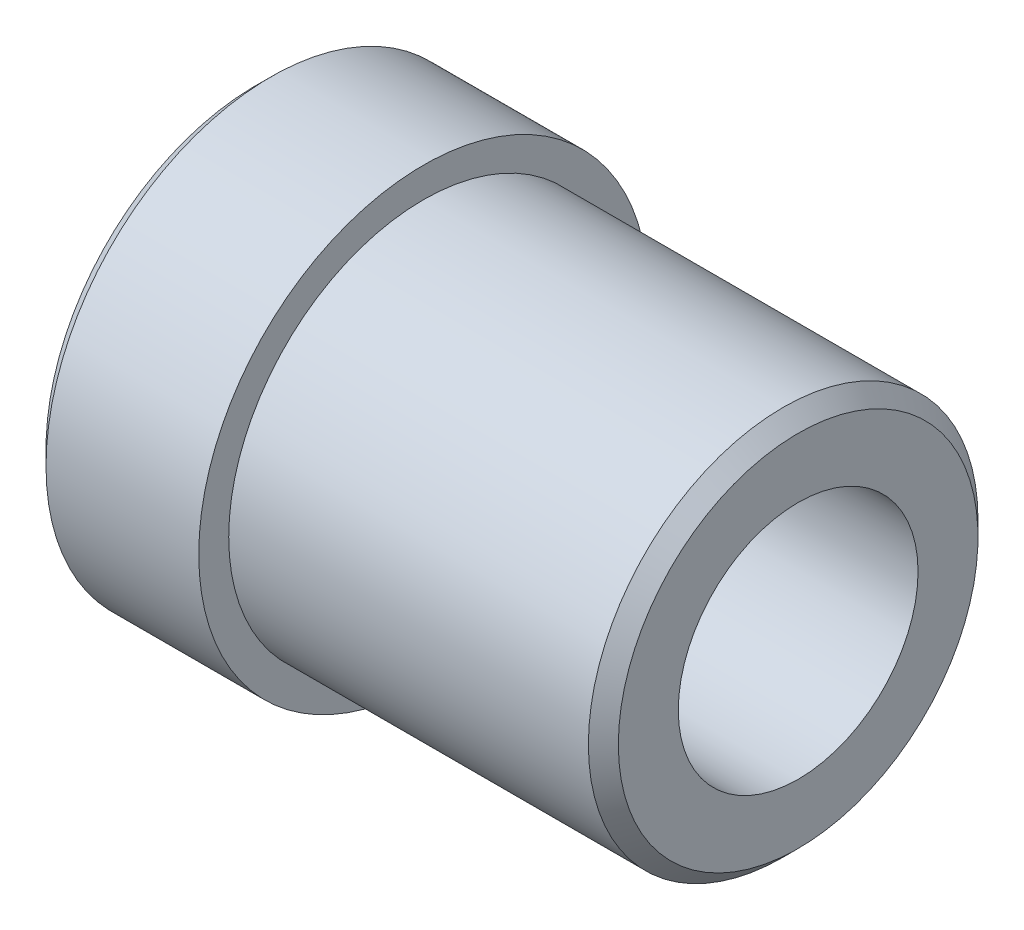
ISO-10303-21;
HEADER;
FILE_DESCRIPTION(('STEP AP214'),'2;1');
FILE_NAME('part.step','',(''),(''),'','','');
FILE_SCHEMA(('AUTOMOTIVE_DESIGN { 1 0 10303 214 1 1 1 1 }'));
ENDSEC;
DATA;
#1=APPLICATION_CONTEXT('core data for automotive mechanical design processes');
#2=APPLICATION_PROTOCOL_DEFINITION('international standard','automotive_design',2000,#1);
#3=PRODUCT_CONTEXT('',#1,'mechanical');
#4=PRODUCT('Part','Part','',(#3));
#5=PRODUCT_RELATED_PRODUCT_CATEGORY('part','',(#4));
#6=PRODUCT_DEFINITION_FORMATION('','',#4);
#7=PRODUCT_DEFINITION_CONTEXT('part definition',#1,'design');
#8=PRODUCT_DEFINITION('design','',#6,#7);
#9=PRODUCT_DEFINITION_SHAPE('','',#8);
#10=(LENGTH_UNIT() NAMED_UNIT(*) SI_UNIT(.MILLI.,.METRE.));
#11=(NAMED_UNIT(*) PLANE_ANGLE_UNIT() SI_UNIT($,.RADIAN.));
#12=(NAMED_UNIT(*) SI_UNIT($,.STERADIAN.) SOLID_ANGLE_UNIT());
#13=UNCERTAINTY_MEASURE_WITH_UNIT(LENGTH_MEASURE(1.E-05),#10,'distance_accuracy_value','');
#14=(GEOMETRIC_REPRESENTATION_CONTEXT(3) GLOBAL_UNCERTAINTY_ASSIGNED_CONTEXT((#13)) GLOBAL_UNIT_ASSIGNED_CONTEXT((#10,
#11,#12)) REPRESENTATION_CONTEXT('',''));
#15=CARTESIAN_POINT('',(0.,0.,0.));
#16=DIRECTION('',(0.,0.,1.));
#17=DIRECTION('',(1.,0.,0.));
#18=AXIS2_PLACEMENT_3D('',#15,#16,#17);
#19=CARTESIAN_POINT('',(0.,15.,0.));
#20=DIRECTION('',(1.,0.,0.));
#21=DIRECTION('',(0.,0.,-1.));
#22=AXIS2_PLACEMENT_3D('',#19,#20,#21);
#23=PLANE('',#22);
#24=CARTESIAN_POINT('',(0.,0.,0.));
#25=DIRECTION('',(1.,0.,0.));
#26=DIRECTION('',(0.,0.,-1.));
#27=AXIS2_PLACEMENT_3D('',#24,#25,#26);
#28=CIRCLE('',#27,14.);
#29=CARTESIAN_POINT('',(0.,0.,-14.));
#30=VERTEX_POINT('',#29);
#31=EDGE_CURVE('E48',#30,#30,#28,.F.);
#32=ORIENTED_EDGE('',*,*,#31,.T.);
#33=EDGE_LOOP('',(#32));
#34=FACE_BOUND('',#33,.T.);
#35=CARTESIAN_POINT('',(0.,0.,0.));
#36=DIRECTION('',(-1.,0.,0.));
#37=DIRECTION('',(0.,0.,1.));
#38=AXIS2_PLACEMENT_3D('',#35,#36,#37);
#39=CIRCLE('',#38,8.);
#40=CARTESIAN_POINT('',(0.,0.,8.));
#41=VERTEX_POINT('',#40);
#42=EDGE_CURVE('E63',#41,#41,#39,.T.);
#43=ORIENTED_EDGE('',*,*,#42,.F.);
#44=EDGE_LOOP('',(#43));
#45=FACE_BOUND('',#44,.T.);
#46=ADVANCED_FACE('F33',(#34,#45),#23,.F.);
#47=CARTESIAN_POINT('',(0.,0.,0.));
#48=DIRECTION('',(-1.,0.,0.));
#49=DIRECTION('',(0.,0.,1.));
#50=AXIS2_PLACEMENT_3D('',#47,#48,#49);
#51=CYLINDRICAL_SURFACE('',#50,15.);
#52=CARTESIAN_POINT('',(1.00000000000001,0.,0.));
#53=DIRECTION('',(1.,0.,0.));
#54=DIRECTION('',(0.,0.,-1.));
#55=AXIS2_PLACEMENT_3D('',#52,#53,#54);
#56=CIRCLE('',#55,15.);
#57=CARTESIAN_POINT('',(1.00000000000001,0.,-15.));
#58=VERTEX_POINT('',#57);
#59=EDGE_CURVE('E43',#58,#58,#56,.T.);
#60=ORIENTED_EDGE('',*,*,#59,.T.);
#61=EDGE_LOOP('',(#60));
#62=FACE_BOUND('',#61,.T.);
#63=CARTESIAN_POINT('',(11.1929723502304,0.,0.));
#64=DIRECTION('',(-1.,0.,0.));
#65=DIRECTION('',(0.,0.,1.));
#66=AXIS2_PLACEMENT_3D('',#63,#64,#65);
#67=CIRCLE('',#66,15.);
#68=CARTESIAN_POINT('',(11.1929723502304,0.,15.));
#69=VERTEX_POINT('',#68);
#70=EDGE_CURVE('E54',#69,#69,#67,.T.);
#71=ORIENTED_EDGE('',*,*,#70,.T.);
#72=EDGE_LOOP('',(#71));
#73=FACE_BOUND('',#72,.T.);
#74=ADVANCED_FACE('F70',(#62,#73),#51,.T.);
#75=CARTESIAN_POINT('',(11.1929723502304,13.,0.));
#76=DIRECTION('',(-1.,0.,0.));
#77=DIRECTION('',(0.,0.,1.));
#78=AXIS2_PLACEMENT_3D('',#75,#76,#77);
#79=PLANE('',#78);
#80=ORIENTED_EDGE('',*,*,#70,.F.);
#81=EDGE_LOOP('',(#80));
#82=FACE_BOUND('',#81,.T.);
#83=CARTESIAN_POINT('',(11.1929723502304,0.,0.));
#84=DIRECTION('',(-1.,0.,0.));
#85=DIRECTION('',(0.,0.,1.));
#86=AXIS2_PLACEMENT_3D('',#83,#84,#85);
#87=CIRCLE('',#86,13.);
#88=CARTESIAN_POINT('',(11.1929723502304,0.,13.));
#89=VERTEX_POINT('',#88);
#90=EDGE_CURVE('E57',#89,#89,#87,.T.);
#91=ORIENTED_EDGE('',*,*,#90,.T.);
#92=EDGE_LOOP('',(#91));
#93=FACE_BOUND('',#92,.T.);
#94=ADVANCED_FACE('F75',(#82,#93),#79,.F.);
#95=CARTESIAN_POINT('',(0.,0.,0.));
#96=DIRECTION('',(-1.,0.,0.));
#97=DIRECTION('',(0.,0.,1.));
#98=AXIS2_PLACEMENT_3D('',#95,#96,#97);
#99=CYLINDRICAL_SURFACE('',#98,13.);
#100=CARTESIAN_POINT('',(35.1929723502304,0.,0.));
#101=DIRECTION('',(-1.,0.,0.));
#102=DIRECTION('',(0.,0.,1.));
#103=AXIS2_PLACEMENT_3D('',#100,#101,#102);
#104=CIRCLE('',#103,13.);
#105=CARTESIAN_POINT('',(35.1929723502304,0.,13.));
#106=VERTEX_POINT('',#105);
#107=EDGE_CURVE('E39',#106,#106,#104,.T.);
#108=ORIENTED_EDGE('',*,*,#107,.T.);
#109=EDGE_LOOP('',(#108));
#110=FACE_BOUND('',#109,.T.);
#111=ORIENTED_EDGE('',*,*,#90,.F.);
#112=EDGE_LOOP('',(#111));
#113=FACE_BOUND('',#112,.T.);
#114=ADVANCED_FACE('F97',(#110,#113),#99,.T.);
#115=CARTESIAN_POINT('',(36.1929723502304,8.,0.));
#116=DIRECTION('',(-1.,0.,0.));
#117=DIRECTION('',(0.,0.,1.));
#118=AXIS2_PLACEMENT_3D('',#115,#116,#117);
#119=PLANE('',#118);
#120=CARTESIAN_POINT('',(36.1929723502304,0.,0.));
#121=DIRECTION('',(-1.,0.,0.));
#122=DIRECTION('',(0.,0.,1.));
#123=AXIS2_PLACEMENT_3D('',#120,#121,#122);
#124=CIRCLE('',#123,12.);
#125=CARTESIAN_POINT('',(36.1929723502304,0.,12.));
#126=VERTEX_POINT('',#125);
#127=EDGE_CURVE('E10',#126,#126,#124,.F.);
#128=ORIENTED_EDGE('',*,*,#127,.T.);
#129=EDGE_LOOP('',(#128));
#130=FACE_BOUND('',#129,.T.);
#131=CARTESIAN_POINT('',(36.1929723502304,0.,0.));
#132=DIRECTION('',(-1.,0.,0.));
#133=DIRECTION('',(0.,0.,1.));
#134=AXIS2_PLACEMENT_3D('',#131,#132,#133);
#135=CIRCLE('',#134,8.);
#136=CARTESIAN_POINT('',(36.1929723502304,0.,8.));
#137=VERTEX_POINT('',#136);
#138=EDGE_CURVE('E60',#137,#137,#135,.T.);
#139=ORIENTED_EDGE('',*,*,#138,.T.);
#140=EDGE_LOOP('',(#139));
#141=FACE_BOUND('',#140,.T.);
#142=ADVANCED_FACE('F90',(#130,#141),#119,.F.);
#143=CARTESIAN_POINT('',(0.,0.,0.));
#144=DIRECTION('',(-1.,0.,0.));
#145=DIRECTION('',(0.,0.,1.));
#146=AXIS2_PLACEMENT_3D('',#143,#144,#145);
#147=CYLINDRICAL_SURFACE('',#146,8.);
#148=ORIENTED_EDGE('',*,*,#138,.F.);
#149=EDGE_LOOP('',(#148));
#150=FACE_BOUND('',#149,.T.);
#151=ORIENTED_EDGE('',*,*,#42,.T.);
#152=EDGE_LOOP('',(#151));
#153=FACE_BOUND('',#152,.T.);
#154=ADVANCED_FACE('F67',(#150,#153),#147,.F.);
#155=CARTESIAN_POINT('',(0.,0.,0.));
#156=DIRECTION('',(1.,0.,0.));
#157=DIRECTION('',(0.,0.,-1.));
#158=AXIS2_PLACEMENT_3D('',#155,#156,#157);
#159=CONICAL_SURFACE('',#158,14.,0.785398163397454);
#160=ORIENTED_EDGE('',*,*,#59,.F.);
#161=EDGE_LOOP('',(#160));
#162=FACE_BOUND('',#161,.T.);
#163=ORIENTED_EDGE('',*,*,#31,.F.);
#164=EDGE_LOOP('',(#163));
#165=FACE_BOUND('',#164,.T.);
#166=ADVANCED_FACE('F79',(#162,#165),#159,.T.);
#167=CARTESIAN_POINT('',(35.1929723502304,0.,0.));
#168=DIRECTION('',(-1.,0.,0.));
#169=DIRECTION('',(0.,0.,1.));
#170=AXIS2_PLACEMENT_3D('',#167,#168,#169);
#171=CONICAL_SURFACE('',#170,13.,0.785398163397445);
#172=ORIENTED_EDGE('',*,*,#127,.F.);
#173=EDGE_LOOP('',(#172));
#174=FACE_BOUND('',#173,.T.);
#175=ORIENTED_EDGE('',*,*,#107,.F.);
#176=EDGE_LOOP('',(#175));
#177=FACE_BOUND('',#176,.T.);
#178=ADVANCED_FACE('F81',(#174,#177),#171,.T.);
#179=CLOSED_SHELL('',(#46,#74,#94,#114,#142,#154,#166,#178));
#180=MANIFOLD_SOLID_BREP('B2',#179);
#181=ADVANCED_BREP_SHAPE_REPRESENTATION('',(#18,#180),#14);
#182=SHAPE_DEFINITION_REPRESENTATION(#9,#181);
ENDSEC;
END-ISO-10303-21;
